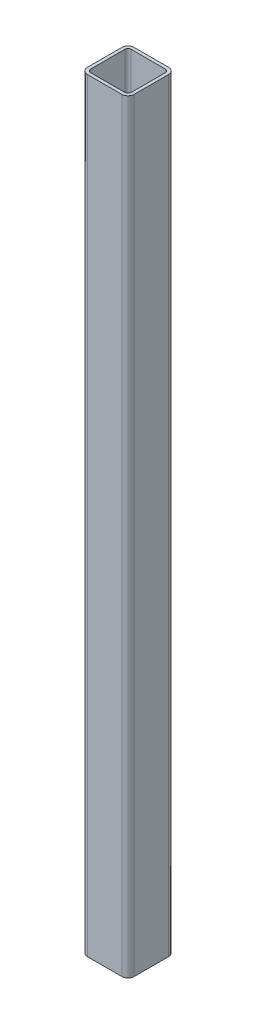
ISO-10303-21;
HEADER;
FILE_DESCRIPTION(('STEP AP214'),'2;1');
FILE_NAME('part.step','',(''),(''),'','','');
FILE_SCHEMA(('AUTOMOTIVE_DESIGN { 1 0 10303 214 1 1 1 1 }'));
ENDSEC;
DATA;
#1=APPLICATION_CONTEXT('core data for automotive mechanical design processes');
#2=APPLICATION_PROTOCOL_DEFINITION('international standard','automotive_design',2000,#1);
#3=PRODUCT_CONTEXT('',#1,'mechanical');
#4=PRODUCT('Part','Part','',(#3));
#5=PRODUCT_RELATED_PRODUCT_CATEGORY('part','',(#4));
#6=PRODUCT_DEFINITION_FORMATION('','',#4);
#7=PRODUCT_DEFINITION_CONTEXT('part definition',#1,'design');
#8=PRODUCT_DEFINITION('design','',#6,#7);
#9=PRODUCT_DEFINITION_SHAPE('','',#8);
#10=(LENGTH_UNIT() NAMED_UNIT(*) SI_UNIT(.MILLI.,.METRE.));
#11=(NAMED_UNIT(*) PLANE_ANGLE_UNIT() SI_UNIT($,.RADIAN.));
#12=(NAMED_UNIT(*) SI_UNIT($,.STERADIAN.) SOLID_ANGLE_UNIT());
#13=UNCERTAINTY_MEASURE_WITH_UNIT(LENGTH_MEASURE(1.E-05),#10,'distance_accuracy_value','');
#14=(GEOMETRIC_REPRESENTATION_CONTEXT(3) GLOBAL_UNCERTAINTY_ASSIGNED_CONTEXT((#13)) GLOBAL_UNIT_ASSIGNED_CONTEXT((#10,
#11,#12)) REPRESENTATION_CONTEXT('',''));
#15=CARTESIAN_POINT('',(0.,0.,0.));
#16=DIRECTION('',(0.,0.,1.));
#17=DIRECTION('',(1.,0.,0.));
#18=AXIS2_PLACEMENT_3D('',#15,#16,#17);
#19=CARTESIAN_POINT('',(-11.,245.,11.));
#20=DIRECTION('',(0.,-1.,0.));
#21=DIRECTION('',(0.,0.,-1.));
#22=AXIS2_PLACEMENT_3D('',#19,#20,#21);
#23=PLANE('',#22);
#24=CARTESIAN_POINT('',(-11.,245.,11.));
#25=DIRECTION('',(0.,1.,0.));
#26=DIRECTION('',(0.,0.,-1.));
#27=AXIS2_PLACEMENT_3D('',#24,#25,#26);
#28=CIRCLE('',#27,4.);
#29=CARTESIAN_POINT('',(-15.,245.,11.));
#30=VERTEX_POINT('',#29);
#31=CARTESIAN_POINT('',(-11.,245.,15.));
#32=VERTEX_POINT('',#31);
#33=EDGE_CURVE('E213',#30,#32,#28,.T.);
#34=ORIENTED_EDGE('',*,*,#33,.T.);
#35=DIRECTION('',(1.,0.,0.));
#36=VECTOR('',#35,1.);
#37=CARTESIAN_POINT('',(-11.,245.,15.));
#38=LINE('',#37,#36);
#39=CARTESIAN_POINT('',(11.,245.,15.));
#40=VERTEX_POINT('',#39);
#41=EDGE_CURVE('E216',#32,#40,#38,.T.);
#42=ORIENTED_EDGE('',*,*,#41,.T.);
#43=CARTESIAN_POINT('',(11.,245.,11.));
#44=DIRECTION('',(0.,1.,0.));
#45=DIRECTION('',(0.,0.,1.));
#46=AXIS2_PLACEMENT_3D('',#43,#44,#45);
#47=CIRCLE('',#46,4.);
#48=CARTESIAN_POINT('',(15.,245.,11.));
#49=VERTEX_POINT('',#48);
#50=EDGE_CURVE('E219',#40,#49,#47,.T.);
#51=ORIENTED_EDGE('',*,*,#50,.T.);
#52=DIRECTION('',(0.,0.,-1.));
#53=VECTOR('',#52,1.);
#54=CARTESIAN_POINT('',(15.,245.,11.));
#55=LINE('',#54,#53);
#56=CARTESIAN_POINT('',(15.,245.,-11.));
#57=VERTEX_POINT('',#56);
#58=EDGE_CURVE('E221',#49,#57,#55,.T.);
#59=ORIENTED_EDGE('',*,*,#58,.T.);
#60=CARTESIAN_POINT('',(11.,245.,-11.));
#61=DIRECTION('',(0.,1.,0.));
#62=DIRECTION('',(0.,0.,-1.));
#63=AXIS2_PLACEMENT_3D('',#60,#61,#62);
#64=CIRCLE('',#63,4.);
#65=CARTESIAN_POINT('',(11.,245.,-15.));
#66=VERTEX_POINT('',#65);
#67=EDGE_CURVE('E223',#57,#66,#64,.T.);
#68=ORIENTED_EDGE('',*,*,#67,.T.);
#69=DIRECTION('',(-1.,0.,0.));
#70=VECTOR('',#69,1.);
#71=CARTESIAN_POINT('',(-11.,245.,-15.));
#72=LINE('',#71,#70);
#73=CARTESIAN_POINT('',(-11.,245.,-15.));
#74=VERTEX_POINT('',#73);
#75=EDGE_CURVE('E225',#66,#74,#72,.T.);
#76=ORIENTED_EDGE('',*,*,#75,.T.);
#77=CARTESIAN_POINT('',(-11.,245.,-11.));
#78=DIRECTION('',(0.,1.,0.));
#79=DIRECTION('',(0.,0.,-1.));
#80=AXIS2_PLACEMENT_3D('',#77,#78,#79);
#81=CIRCLE('',#80,4.);
#82=CARTESIAN_POINT('',(-15.,245.,-11.));
#83=VERTEX_POINT('',#82);
#84=EDGE_CURVE('E227',#74,#83,#81,.T.);
#85=ORIENTED_EDGE('',*,*,#84,.T.);
#86=DIRECTION('',(0.,0.,1.));
#87=VECTOR('',#86,1.);
#88=CARTESIAN_POINT('',(-15.,245.,11.));
#89=LINE('',#88,#87);
#90=EDGE_CURVE('E229',#83,#30,#89,.T.);
#91=ORIENTED_EDGE('',*,*,#90,.T.);
#92=EDGE_LOOP('',(#34,#42,#51,#59,#68,#76,#85,#91));
#93=FACE_BOUND('',#92,.T.);
#94=CARTESIAN_POINT('',(-11.,245.,11.));
#95=DIRECTION('',(0.,1.,0.));
#96=DIRECTION('',(0.,0.,-1.));
#97=AXIS2_PLACEMENT_3D('',#94,#95,#96);
#98=CIRCLE('',#97,2.);
#99=CARTESIAN_POINT('',(-13.,245.,11.));
#100=VERTEX_POINT('',#99);
#101=CARTESIAN_POINT('',(-11.,245.,13.));
#102=VERTEX_POINT('',#101);
#103=EDGE_CURVE('E148',#100,#102,#98,.T.);
#104=ORIENTED_EDGE('',*,*,#103,.F.);
#105=DIRECTION('',(0.,0.,1.));
#106=VECTOR('',#105,1.);
#107=CARTESIAN_POINT('',(-13.,245.,11.));
#108=LINE('',#107,#106);
#109=CARTESIAN_POINT('',(-13.,245.,-11.));
#110=VERTEX_POINT('',#109);
#111=EDGE_CURVE('E181',#110,#100,#108,.T.);
#112=ORIENTED_EDGE('',*,*,#111,.F.);
#113=CARTESIAN_POINT('',(-11.,245.,-11.));
#114=DIRECTION('',(0.,1.,0.));
#115=DIRECTION('',(0.,0.,-1.));
#116=AXIS2_PLACEMENT_3D('',#113,#114,#115);
#117=CIRCLE('',#116,2.);
#118=CARTESIAN_POINT('',(-11.,245.,-13.));
#119=VERTEX_POINT('',#118);
#120=EDGE_CURVE('E179',#119,#110,#117,.T.);
#121=ORIENTED_EDGE('',*,*,#120,.F.);
#122=DIRECTION('',(-1.,0.,0.));
#123=VECTOR('',#122,1.);
#124=CARTESIAN_POINT('',(-11.,245.,-13.));
#125=LINE('',#124,#123);
#126=CARTESIAN_POINT('',(11.,245.,-13.));
#127=VERTEX_POINT('',#126);
#128=EDGE_CURVE('E177',#127,#119,#125,.T.);
#129=ORIENTED_EDGE('',*,*,#128,.F.);
#130=CARTESIAN_POINT('',(11.,245.,-11.));
#131=DIRECTION('',(0.,1.,0.));
#132=DIRECTION('',(0.,0.,-1.));
#133=AXIS2_PLACEMENT_3D('',#130,#131,#132);
#134=CIRCLE('',#133,2.);
#135=CARTESIAN_POINT('',(13.,245.,-11.));
#136=VERTEX_POINT('',#135);
#137=EDGE_CURVE('E175',#136,#127,#134,.T.);
#138=ORIENTED_EDGE('',*,*,#137,.F.);
#139=DIRECTION('',(0.,0.,-1.));
#140=VECTOR('',#139,1.);
#141=CARTESIAN_POINT('',(13.,245.,11.));
#142=LINE('',#141,#140);
#143=CARTESIAN_POINT('',(13.,245.,11.));
#144=VERTEX_POINT('',#143);
#145=EDGE_CURVE('E171',#144,#136,#142,.T.);
#146=ORIENTED_EDGE('',*,*,#145,.F.);
#147=CARTESIAN_POINT('',(11.,245.,11.));
#148=DIRECTION('',(0.,1.,0.));
#149=DIRECTION('',(0.,0.,1.));
#150=AXIS2_PLACEMENT_3D('',#147,#148,#149);
#151=CIRCLE('',#150,2.);
#152=CARTESIAN_POINT('',(11.,245.,13.));
#153=VERTEX_POINT('',#152);
#154=EDGE_CURVE('E169',#153,#144,#151,.T.);
#155=ORIENTED_EDGE('',*,*,#154,.F.);
#156=DIRECTION('',(1.,0.,0.));
#157=VECTOR('',#156,1.);
#158=CARTESIAN_POINT('',(-11.,245.,13.));
#159=LINE('',#158,#157);
#160=EDGE_CURVE('E156',#102,#153,#159,.T.);
#161=ORIENTED_EDGE('',*,*,#160,.F.);
#162=EDGE_LOOP('',(#104,#112,#121,#129,#138,#146,#155,#161));
#163=FACE_BOUND('',#162,.T.);
#164=ADVANCED_FACE('F35',(#93,#163),#23,.F.);
#165=CARTESIAN_POINT('',(-11.,-245.,11.));
#166=DIRECTION('',(0.,-1.,0.));
#167=DIRECTION('',(0.,0.,-1.));
#168=AXIS2_PLACEMENT_3D('',#165,#166,#167);
#169=PLANE('',#168);
#170=CARTESIAN_POINT('',(-11.,-245.,11.));
#171=DIRECTION('',(0.,1.,0.));
#172=DIRECTION('',(0.,0.,-1.));
#173=AXIS2_PLACEMENT_3D('',#170,#171,#172);
#174=CIRCLE('',#173,4.);
#175=CARTESIAN_POINT('',(-15.,-245.,11.));
#176=VERTEX_POINT('',#175);
#177=CARTESIAN_POINT('',(-11.,-245.,15.));
#178=VERTEX_POINT('',#177);
#179=EDGE_CURVE('E164',#176,#178,#174,.T.);
#180=ORIENTED_EDGE('',*,*,#179,.F.);
#181=DIRECTION('',(0.,0.,1.));
#182=VECTOR('',#181,1.);
#183=CARTESIAN_POINT('',(-15.,-245.,11.));
#184=LINE('',#183,#182);
#185=CARTESIAN_POINT('',(-15.,-245.,-11.));
#186=VERTEX_POINT('',#185);
#187=EDGE_CURVE('E217',#186,#176,#184,.T.);
#188=ORIENTED_EDGE('',*,*,#187,.F.);
#189=CARTESIAN_POINT('',(-11.,-245.,-11.));
#190=DIRECTION('',(0.,1.,0.));
#191=DIRECTION('',(0.,0.,-1.));
#192=AXIS2_PLACEMENT_3D('',#189,#190,#191);
#193=CIRCLE('',#192,4.);
#194=CARTESIAN_POINT('',(-11.,-245.,-15.));
#195=VERTEX_POINT('',#194);
#196=EDGE_CURVE('E244',#195,#186,#193,.T.);
#197=ORIENTED_EDGE('',*,*,#196,.F.);
#198=DIRECTION('',(-1.,0.,0.));
#199=VECTOR('',#198,1.);
#200=CARTESIAN_POINT('',(-11.,-245.,-15.));
#201=LINE('',#200,#199);
#202=CARTESIAN_POINT('',(11.,-245.,-15.));
#203=VERTEX_POINT('',#202);
#204=EDGE_CURVE('E242',#203,#195,#201,.T.);
#205=ORIENTED_EDGE('',*,*,#204,.F.);
#206=CARTESIAN_POINT('',(11.,-245.,-11.));
#207=DIRECTION('',(0.,1.,0.));
#208=DIRECTION('',(0.,0.,-1.));
#209=AXIS2_PLACEMENT_3D('',#206,#207,#208);
#210=CIRCLE('',#209,4.);
#211=CARTESIAN_POINT('',(15.,-245.,-11.));
#212=VERTEX_POINT('',#211);
#213=EDGE_CURVE('E240',#212,#203,#210,.T.);
#214=ORIENTED_EDGE('',*,*,#213,.F.);
#215=DIRECTION('',(0.,0.,-1.));
#216=VECTOR('',#215,1.);
#217=CARTESIAN_POINT('',(15.,-245.,11.));
#218=LINE('',#217,#216);
#219=CARTESIAN_POINT('',(15.,-245.,11.));
#220=VERTEX_POINT('',#219);
#221=EDGE_CURVE('E238',#220,#212,#218,.T.);
#222=ORIENTED_EDGE('',*,*,#221,.F.);
#223=CARTESIAN_POINT('',(11.,-245.,11.));
#224=DIRECTION('',(0.,1.,0.));
#225=DIRECTION('',(0.,0.,1.));
#226=AXIS2_PLACEMENT_3D('',#223,#224,#225);
#227=CIRCLE('',#226,4.);
#228=CARTESIAN_POINT('',(11.,-245.,15.));
#229=VERTEX_POINT('',#228);
#230=EDGE_CURVE('E236',#229,#220,#227,.T.);
#231=ORIENTED_EDGE('',*,*,#230,.F.);
#232=DIRECTION('',(1.,0.,0.));
#233=VECTOR('',#232,1.);
#234=CARTESIAN_POINT('',(-11.,-245.,15.));
#235=LINE('',#234,#233);
#236=EDGE_CURVE('E234',#178,#229,#235,.T.);
#237=ORIENTED_EDGE('',*,*,#236,.F.);
#238=EDGE_LOOP('',(#180,#188,#197,#205,#214,#222,#231,#237));
#239=FACE_BOUND('',#238,.T.);
#240=DIRECTION('',(0.,0.,1.));
#241=VECTOR('',#240,1.);
#242=CARTESIAN_POINT('',(-13.,-245.,11.));
#243=LINE('',#242,#241);
#244=CARTESIAN_POINT('',(-13.,-245.,-11.));
#245=VERTEX_POINT('',#244);
#246=CARTESIAN_POINT('',(-13.,-245.,11.));
#247=VERTEX_POINT('',#246);
#248=EDGE_CURVE('E157',#245,#247,#243,.T.);
#249=ORIENTED_EDGE('',*,*,#248,.T.);
#250=CARTESIAN_POINT('',(-11.,-245.,11.));
#251=DIRECTION('',(0.,1.,0.));
#252=DIRECTION('',(0.,0.,-1.));
#253=AXIS2_PLACEMENT_3D('',#250,#251,#252);
#254=CIRCLE('',#253,2.);
#255=CARTESIAN_POINT('',(-11.,-245.,13.));
#256=VERTEX_POINT('',#255);
#257=EDGE_CURVE('E58',#247,#256,#254,.T.);
#258=ORIENTED_EDGE('',*,*,#257,.T.);
#259=DIRECTION('',(1.,0.,0.));
#260=VECTOR('',#259,1.);
#261=CARTESIAN_POINT('',(-11.,-245.,13.));
#262=LINE('',#261,#260);
#263=CARTESIAN_POINT('',(11.,-245.,13.));
#264=VERTEX_POINT('',#263);
#265=EDGE_CURVE('E163',#256,#264,#262,.T.);
#266=ORIENTED_EDGE('',*,*,#265,.T.);
#267=CARTESIAN_POINT('',(11.,-245.,11.));
#268=DIRECTION('',(0.,1.,0.));
#269=DIRECTION('',(0.,0.,1.));
#270=AXIS2_PLACEMENT_3D('',#267,#268,#269);
#271=CIRCLE('',#270,2.);
#272=CARTESIAN_POINT('',(13.,-245.,11.));
#273=VERTEX_POINT('',#272);
#274=EDGE_CURVE('E185',#264,#273,#271,.T.);
#275=ORIENTED_EDGE('',*,*,#274,.T.);
#276=DIRECTION('',(0.,0.,-1.));
#277=VECTOR('',#276,1.);
#278=CARTESIAN_POINT('',(13.,-245.,11.));
#279=LINE('',#278,#277);
#280=CARTESIAN_POINT('',(13.,-245.,-11.));
#281=VERTEX_POINT('',#280);
#282=EDGE_CURVE('E188',#273,#281,#279,.T.);
#283=ORIENTED_EDGE('',*,*,#282,.T.);
#284=CARTESIAN_POINT('',(11.,-245.,-11.));
#285=DIRECTION('',(0.,1.,0.));
#286=DIRECTION('',(0.,0.,-1.));
#287=AXIS2_PLACEMENT_3D('',#284,#285,#286);
#288=CIRCLE('',#287,2.);
#289=CARTESIAN_POINT('',(11.,-245.,-13.));
#290=VERTEX_POINT('',#289);
#291=EDGE_CURVE('E191',#281,#290,#288,.T.);
#292=ORIENTED_EDGE('',*,*,#291,.T.);
#293=DIRECTION('',(-1.,0.,0.));
#294=VECTOR('',#293,1.);
#295=CARTESIAN_POINT('',(-11.,-245.,-13.));
#296=LINE('',#295,#294);
#297=CARTESIAN_POINT('',(-11.,-245.,-13.));
#298=VERTEX_POINT('',#297);
#299=EDGE_CURVE('E194',#290,#298,#296,.T.);
#300=ORIENTED_EDGE('',*,*,#299,.T.);
#301=CARTESIAN_POINT('',(-11.,-245.,-11.));
#302=DIRECTION('',(0.,1.,0.));
#303=DIRECTION('',(0.,0.,-1.));
#304=AXIS2_PLACEMENT_3D('',#301,#302,#303);
#305=CIRCLE('',#304,2.);
#306=EDGE_CURVE('E197',#298,#245,#305,.T.);
#307=ORIENTED_EDGE('',*,*,#306,.T.);
#308=EDGE_LOOP('',(#249,#258,#266,#275,#283,#292,#300,#307));
#309=FACE_BOUND('',#308,.T.);
#310=ADVANCED_FACE('F274',(#239,#309),#169,.T.);
#311=CARTESIAN_POINT('',(-11.,245.,11.));
#312=DIRECTION('',(0.,-1.,0.));
#313=DIRECTION('',(0.,0.,-1.));
#314=AXIS2_PLACEMENT_3D('',#311,#312,#313);
#315=CYLINDRICAL_SURFACE('',#314,4.);
#316=ORIENTED_EDGE('',*,*,#179,.T.);
#317=DIRECTION('',(0.,-1.,0.));
#318=VECTOR('',#317,1.);
#319=CARTESIAN_POINT('',(-11.,245.,15.));
#320=LINE('',#319,#318);
#321=EDGE_CURVE('E11',#32,#178,#320,.T.);
#322=ORIENTED_EDGE('',*,*,#321,.F.);
#323=ORIENTED_EDGE('',*,*,#33,.F.);
#324=DIRECTION('',(0.,-1.,0.));
#325=VECTOR('',#324,1.);
#326=CARTESIAN_POINT('',(-15.,245.,11.));
#327=LINE('',#326,#325);
#328=EDGE_CURVE('E231',#30,#176,#327,.T.);
#329=ORIENTED_EDGE('',*,*,#328,.T.);
#330=EDGE_LOOP('',(#316,#322,#323,#329));
#331=FACE_BOUND('',#330,.T.);
#332=ADVANCED_FACE('F37',(#331),#315,.T.);
#333=CARTESIAN_POINT('',(-11.,245.,15.));
#334=DIRECTION('',(0.,0.,-1.));
#335=DIRECTION('',(-1.,0.,0.));
#336=AXIS2_PLACEMENT_3D('',#333,#334,#335);
#337=PLANE('',#336);
#338=ORIENTED_EDGE('',*,*,#236,.T.);
#339=DIRECTION('',(0.,-1.,0.));
#340=VECTOR('',#339,1.);
#341=CARTESIAN_POINT('',(11.,245.,15.));
#342=LINE('',#341,#340);
#343=EDGE_CURVE('E43',#40,#229,#342,.T.);
#344=ORIENTED_EDGE('',*,*,#343,.F.);
#345=ORIENTED_EDGE('',*,*,#41,.F.);
#346=ORIENTED_EDGE('',*,*,#321,.T.);
#347=EDGE_LOOP('',(#338,#344,#345,#346));
#348=FACE_BOUND('',#347,.T.);
#349=ADVANCED_FACE('F291',(#348),#337,.F.);
#350=CARTESIAN_POINT('',(11.,245.,11.));
#351=DIRECTION('',(0.,-1.,0.));
#352=DIRECTION('',(0.,0.,-1.));
#353=AXIS2_PLACEMENT_3D('',#350,#351,#352);
#354=CYLINDRICAL_SURFACE('',#353,4.);
#355=ORIENTED_EDGE('',*,*,#230,.T.);
#356=DIRECTION('',(0.,-1.,0.));
#357=VECTOR('',#356,1.);
#358=CARTESIAN_POINT('',(15.,245.,11.));
#359=LINE('',#358,#357);
#360=EDGE_CURVE('E261',#49,#220,#359,.T.);
#361=ORIENTED_EDGE('',*,*,#360,.F.);
#362=ORIENTED_EDGE('',*,*,#50,.F.);
#363=ORIENTED_EDGE('',*,*,#343,.T.);
#364=EDGE_LOOP('',(#355,#361,#362,#363));
#365=FACE_BOUND('',#364,.T.);
#366=ADVANCED_FACE('F268',(#365),#354,.T.);
#367=CARTESIAN_POINT('',(15.,245.,11.));
#368=DIRECTION('',(-1.,0.,0.));
#369=DIRECTION('',(0.,0.,1.));
#370=AXIS2_PLACEMENT_3D('',#367,#368,#369);
#371=PLANE('',#370);
#372=ORIENTED_EDGE('',*,*,#221,.T.);
#373=DIRECTION('',(0.,-1.,0.));
#374=VECTOR('',#373,1.);
#375=CARTESIAN_POINT('',(15.,245.,-11.));
#376=LINE('',#375,#374);
#377=EDGE_CURVE('E258',#57,#212,#376,.T.);
#378=ORIENTED_EDGE('',*,*,#377,.F.);
#379=ORIENTED_EDGE('',*,*,#58,.F.);
#380=ORIENTED_EDGE('',*,*,#360,.T.);
#381=EDGE_LOOP('',(#372,#378,#379,#380));
#382=FACE_BOUND('',#381,.T.);
#383=ADVANCED_FACE('F280',(#382),#371,.F.);
#384=CARTESIAN_POINT('',(11.,245.,-11.));
#385=DIRECTION('',(0.,-1.,0.));
#386=DIRECTION('',(0.,0.,-1.));
#387=AXIS2_PLACEMENT_3D('',#384,#385,#386);
#388=CYLINDRICAL_SURFACE('',#387,4.);
#389=ORIENTED_EDGE('',*,*,#213,.T.);
#390=DIRECTION('',(0.,-1.,0.));
#391=VECTOR('',#390,1.);
#392=CARTESIAN_POINT('',(11.,245.,-15.));
#393=LINE('',#392,#391);
#394=EDGE_CURVE('E255',#66,#203,#393,.T.);
#395=ORIENTED_EDGE('',*,*,#394,.F.);
#396=ORIENTED_EDGE('',*,*,#67,.F.);
#397=ORIENTED_EDGE('',*,*,#377,.T.);
#398=EDGE_LOOP('',(#389,#395,#396,#397));
#399=FACE_BOUND('',#398,.T.);
#400=ADVANCED_FACE('F284',(#399),#388,.T.);
#401=CARTESIAN_POINT('',(-11.,245.,-15.));
#402=DIRECTION('',(0.,0.,1.));
#403=DIRECTION('',(1.,0.,0.));
#404=AXIS2_PLACEMENT_3D('',#401,#402,#403);
#405=PLANE('',#404);
#406=ORIENTED_EDGE('',*,*,#204,.T.);
#407=DIRECTION('',(0.,-1.,0.));
#408=VECTOR('',#407,1.);
#409=CARTESIAN_POINT('',(-11.,245.,-15.));
#410=LINE('',#409,#408);
#411=EDGE_CURVE('E252',#74,#195,#410,.T.);
#412=ORIENTED_EDGE('',*,*,#411,.F.);
#413=ORIENTED_EDGE('',*,*,#75,.F.);
#414=ORIENTED_EDGE('',*,*,#394,.T.);
#415=EDGE_LOOP('',(#406,#412,#413,#414));
#416=FACE_BOUND('',#415,.T.);
#417=ADVANCED_FACE('F304',(#416),#405,.F.);
#418=CARTESIAN_POINT('',(-11.,245.,-11.));
#419=DIRECTION('',(0.,-1.,0.));
#420=DIRECTION('',(0.,0.,-1.));
#421=AXIS2_PLACEMENT_3D('',#418,#419,#420);
#422=CYLINDRICAL_SURFACE('',#421,4.);
#423=ORIENTED_EDGE('',*,*,#196,.T.);
#424=DIRECTION('',(0.,-1.,0.));
#425=VECTOR('',#424,1.);
#426=CARTESIAN_POINT('',(-15.,245.,-11.));
#427=LINE('',#426,#425);
#428=EDGE_CURVE('E249',#83,#186,#427,.T.);
#429=ORIENTED_EDGE('',*,*,#428,.F.);
#430=ORIENTED_EDGE('',*,*,#84,.F.);
#431=ORIENTED_EDGE('',*,*,#411,.T.);
#432=EDGE_LOOP('',(#423,#429,#430,#431));
#433=FACE_BOUND('',#432,.T.);
#434=ADVANCED_FACE('F302',(#433),#422,.T.);
#435=CARTESIAN_POINT('',(-15.,245.,11.));
#436=DIRECTION('',(1.,0.,0.));
#437=DIRECTION('',(0.,0.,-1.));
#438=AXIS2_PLACEMENT_3D('',#435,#436,#437);
#439=PLANE('',#438);
#440=ORIENTED_EDGE('',*,*,#187,.T.);
#441=ORIENTED_EDGE('',*,*,#328,.F.);
#442=ORIENTED_EDGE('',*,*,#90,.F.);
#443=ORIENTED_EDGE('',*,*,#428,.T.);
#444=EDGE_LOOP('',(#440,#441,#442,#443));
#445=FACE_BOUND('',#444,.T.);
#446=ADVANCED_FACE('F297',(#445),#439,.F.);
#447=CARTESIAN_POINT('',(-11.,245.,11.));
#448=DIRECTION('',(0.,-1.,0.));
#449=DIRECTION('',(0.,0.,-1.));
#450=AXIS2_PLACEMENT_3D('',#447,#448,#449);
#451=CYLINDRICAL_SURFACE('',#450,2.);
#452=ORIENTED_EDGE('',*,*,#257,.F.);
#453=DIRECTION('',(0.,-1.,0.));
#454=VECTOR('',#453,1.);
#455=CARTESIAN_POINT('',(-13.,245.,11.));
#456=LINE('',#455,#454);
#457=EDGE_CURVE('E152',#100,#247,#456,.T.);
#458=ORIENTED_EDGE('',*,*,#457,.F.);
#459=ORIENTED_EDGE('',*,*,#103,.T.);
#460=DIRECTION('',(0.,-1.,0.));
#461=VECTOR('',#460,1.);
#462=CARTESIAN_POINT('',(-11.,245.,13.));
#463=LINE('',#462,#461);
#464=EDGE_CURVE('E151',#102,#256,#463,.T.);
#465=ORIENTED_EDGE('',*,*,#464,.T.);
#466=EDGE_LOOP('',(#452,#458,#459,#465));
#467=FACE_BOUND('',#466,.T.);
#468=ADVANCED_FACE('F150',(#467),#451,.F.);
#469=CARTESIAN_POINT('',(-11.,245.,13.));
#470=DIRECTION('',(0.,0.,-1.));
#471=DIRECTION('',(-1.,0.,0.));
#472=AXIS2_PLACEMENT_3D('',#469,#470,#471);
#473=PLANE('',#472);
#474=ORIENTED_EDGE('',*,*,#265,.F.);
#475=ORIENTED_EDGE('',*,*,#464,.F.);
#476=ORIENTED_EDGE('',*,*,#160,.T.);
#477=DIRECTION('',(0.,-1.,0.));
#478=VECTOR('',#477,1.);
#479=CARTESIAN_POINT('',(11.,245.,13.));
#480=LINE('',#479,#478);
#481=EDGE_CURVE('E165',#153,#264,#480,.T.);
#482=ORIENTED_EDGE('',*,*,#481,.T.);
#483=EDGE_LOOP('',(#474,#475,#476,#482));
#484=FACE_BOUND('',#483,.T.);
#485=ADVANCED_FACE('F160',(#484),#473,.T.);
#486=CARTESIAN_POINT('',(11.,245.,11.));
#487=DIRECTION('',(0.,-1.,0.));
#488=DIRECTION('',(0.,0.,-1.));
#489=AXIS2_PLACEMENT_3D('',#486,#487,#488);
#490=CYLINDRICAL_SURFACE('',#489,2.);
#491=ORIENTED_EDGE('',*,*,#274,.F.);
#492=ORIENTED_EDGE('',*,*,#481,.F.);
#493=ORIENTED_EDGE('',*,*,#154,.T.);
#494=DIRECTION('',(0.,-1.,0.));
#495=VECTOR('',#494,1.);
#496=CARTESIAN_POINT('',(13.,245.,11.));
#497=LINE('',#496,#495);
#498=EDGE_CURVE('E210',#144,#273,#497,.T.);
#499=ORIENTED_EDGE('',*,*,#498,.T.);
#500=EDGE_LOOP('',(#491,#492,#493,#499));
#501=FACE_BOUND('',#500,.T.);
#502=ADVANCED_FACE('F329',(#501),#490,.F.);
#503=CARTESIAN_POINT('',(13.,245.,11.));
#504=DIRECTION('',(-1.,0.,0.));
#505=DIRECTION('',(0.,0.,1.));
#506=AXIS2_PLACEMENT_3D('',#503,#504,#505);
#507=PLANE('',#506);
#508=ORIENTED_EDGE('',*,*,#282,.F.);
#509=ORIENTED_EDGE('',*,*,#498,.F.);
#510=ORIENTED_EDGE('',*,*,#145,.T.);
#511=DIRECTION('',(0.,-1.,0.));
#512=VECTOR('',#511,1.);
#513=CARTESIAN_POINT('',(13.,245.,-11.));
#514=LINE('',#513,#512);
#515=EDGE_CURVE('E208',#136,#281,#514,.T.);
#516=ORIENTED_EDGE('',*,*,#515,.T.);
#517=EDGE_LOOP('',(#508,#509,#510,#516));
#518=FACE_BOUND('',#517,.T.);
#519=ADVANCED_FACE('F333',(#518),#507,.T.);
#520=CARTESIAN_POINT('',(11.,245.,-11.));
#521=DIRECTION('',(0.,-1.,0.));
#522=DIRECTION('',(0.,0.,-1.));
#523=AXIS2_PLACEMENT_3D('',#520,#521,#522);
#524=CYLINDRICAL_SURFACE('',#523,2.);
#525=ORIENTED_EDGE('',*,*,#291,.F.);
#526=ORIENTED_EDGE('',*,*,#515,.F.);
#527=ORIENTED_EDGE('',*,*,#137,.T.);
#528=DIRECTION('',(0.,-1.,0.));
#529=VECTOR('',#528,1.);
#530=CARTESIAN_POINT('',(11.,245.,-13.));
#531=LINE('',#530,#529);
#532=EDGE_CURVE('E206',#127,#290,#531,.T.);
#533=ORIENTED_EDGE('',*,*,#532,.T.);
#534=EDGE_LOOP('',(#525,#526,#527,#533));
#535=FACE_BOUND('',#534,.T.);
#536=ADVANCED_FACE('F339',(#535),#524,.F.);
#537=CARTESIAN_POINT('',(-11.,245.,-13.));
#538=DIRECTION('',(0.,0.,1.));
#539=DIRECTION('',(1.,0.,0.));
#540=AXIS2_PLACEMENT_3D('',#537,#538,#539);
#541=PLANE('',#540);
#542=ORIENTED_EDGE('',*,*,#299,.F.);
#543=ORIENTED_EDGE('',*,*,#532,.F.);
#544=ORIENTED_EDGE('',*,*,#128,.T.);
#545=DIRECTION('',(0.,-1.,0.));
#546=VECTOR('',#545,1.);
#547=CARTESIAN_POINT('',(-11.,245.,-13.));
#548=LINE('',#547,#546);
#549=EDGE_CURVE('E204',#119,#298,#548,.T.);
#550=ORIENTED_EDGE('',*,*,#549,.T.);
#551=EDGE_LOOP('',(#542,#543,#544,#550));
#552=FACE_BOUND('',#551,.T.);
#553=ADVANCED_FACE('F343',(#552),#541,.T.);
#554=CARTESIAN_POINT('',(-11.,245.,-11.));
#555=DIRECTION('',(0.,-1.,0.));
#556=DIRECTION('',(0.,0.,-1.));
#557=AXIS2_PLACEMENT_3D('',#554,#555,#556);
#558=CYLINDRICAL_SURFACE('',#557,2.);
#559=ORIENTED_EDGE('',*,*,#306,.F.);
#560=ORIENTED_EDGE('',*,*,#549,.F.);
#561=ORIENTED_EDGE('',*,*,#120,.T.);
#562=DIRECTION('',(0.,-1.,0.));
#563=VECTOR('',#562,1.);
#564=CARTESIAN_POINT('',(-13.,245.,-11.));
#565=LINE('',#564,#563);
#566=EDGE_CURVE('E50',#110,#245,#565,.T.);
#567=ORIENTED_EDGE('',*,*,#566,.T.);
#568=EDGE_LOOP('',(#559,#560,#561,#567));
#569=FACE_BOUND('',#568,.T.);
#570=ADVANCED_FACE('F347',(#569),#558,.F.);
#571=CARTESIAN_POINT('',(-13.,245.,11.));
#572=DIRECTION('',(1.,0.,0.));
#573=DIRECTION('',(0.,0.,-1.));
#574=AXIS2_PLACEMENT_3D('',#571,#572,#573);
#575=PLANE('',#574);
#576=ORIENTED_EDGE('',*,*,#248,.F.);
#577=ORIENTED_EDGE('',*,*,#566,.F.);
#578=ORIENTED_EDGE('',*,*,#111,.T.);
#579=ORIENTED_EDGE('',*,*,#457,.T.);
#580=EDGE_LOOP('',(#576,#577,#578,#579));
#581=FACE_BOUND('',#580,.T.);
#582=ADVANCED_FACE('F351',(#581),#575,.T.);
#583=CLOSED_SHELL('',(#164,#310,#332,#349,#366,#383,#400,#417,#434,#446,#468,#485,#502,#519,
#536,#553,#570,#582));
#584=MANIFOLD_SOLID_BREP('B2',#583);
#585=ADVANCED_BREP_SHAPE_REPRESENTATION('',(#18,#584),#14);
#586=SHAPE_DEFINITION_REPRESENTATION(#9,#585);
ENDSEC;
END-ISO-10303-21;
